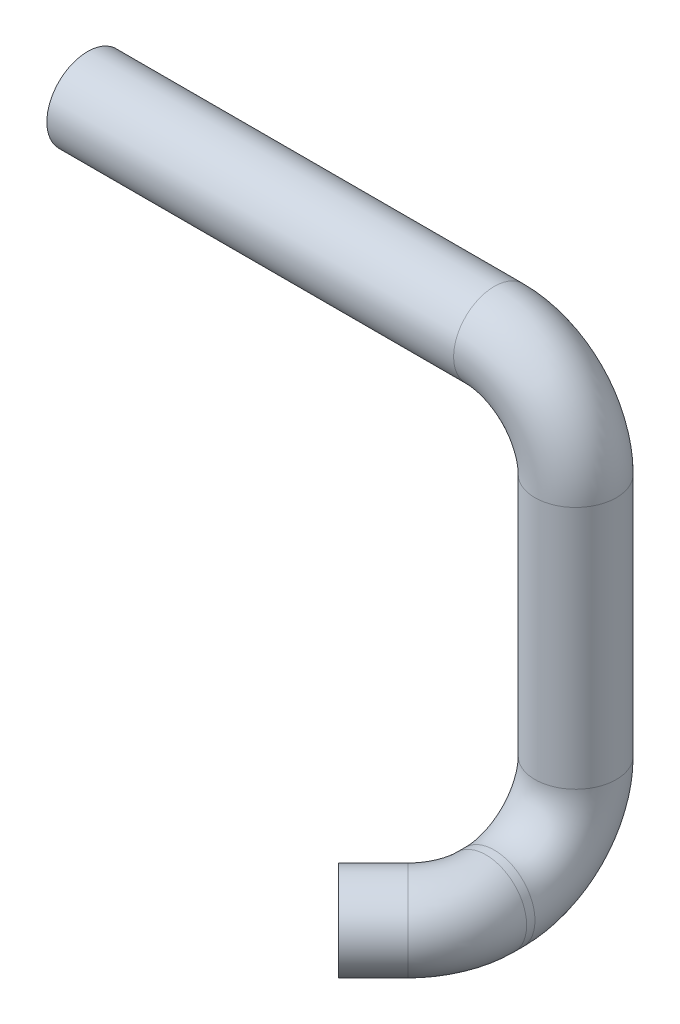
ISO-10303-21;
HEADER;
FILE_DESCRIPTION(('STEP AP214'),'2;1');
FILE_NAME('part.step','',(''),(''),'','','');
FILE_SCHEMA(('AUTOMOTIVE_DESIGN { 1 0 10303 214 1 1 1 1 }'));
ENDSEC;
DATA;
#1=APPLICATION_CONTEXT('core data for automotive mechanical design processes');
#2=APPLICATION_PROTOCOL_DEFINITION('international standard','automotive_design',2000,#1);
#3=PRODUCT_CONTEXT('',#1,'mechanical');
#4=PRODUCT('Part','Part','',(#3));
#5=PRODUCT_RELATED_PRODUCT_CATEGORY('part','',(#4));
#6=PRODUCT_DEFINITION_FORMATION('','',#4);
#7=PRODUCT_DEFINITION_CONTEXT('part definition',#1,'design');
#8=PRODUCT_DEFINITION('design','',#6,#7);
#9=PRODUCT_DEFINITION_SHAPE('','',#8);
#10=(LENGTH_UNIT() NAMED_UNIT(*) SI_UNIT(.MILLI.,.METRE.));
#11=(NAMED_UNIT(*) PLANE_ANGLE_UNIT() SI_UNIT($,.RADIAN.));
#12=(NAMED_UNIT(*) SI_UNIT($,.STERADIAN.) SOLID_ANGLE_UNIT());
#13=UNCERTAINTY_MEASURE_WITH_UNIT(LENGTH_MEASURE(1.E-05),#10,'distance_accuracy_value','');
#14=(GEOMETRIC_REPRESENTATION_CONTEXT(3) GLOBAL_UNCERTAINTY_ASSIGNED_CONTEXT((#13)) GLOBAL_UNIT_ASSIGNED_CONTEXT((#10,
#11,#12)) REPRESENTATION_CONTEXT('',''));
#15=CARTESIAN_POINT('',(0.,0.,0.));
#16=DIRECTION('',(0.,0.,1.));
#17=DIRECTION('',(1.,0.,0.));
#18=AXIS2_PLACEMENT_3D('',#15,#16,#17);
#19=CARTESIAN_POINT('',(36.3145229381132,-31.75,11.3104770618868));
#20=DIRECTION('',(-0.707106781186548,0.,0.707106781186547));
#21=DIRECTION('',(0.707106781186547,0.,0.707106781186548));
#22=AXIS2_PLACEMENT_3D('',#19,#20,#21);
#23=CYLINDRICAL_SURFACE('',#22,3.175);
#24=CARTESIAN_POINT('',(36.3145229381132,-31.75,11.3104770618868));
#25=DIRECTION('',(-0.707106781186548,0.,0.707106781186547));
#26=DIRECTION('',(0.,-1.,0.));
#27=AXIS2_PLACEMENT_3D('',#24,#25,#26);
#28=CIRCLE('',#27,3.175);
#29=CARTESIAN_POINT('',(38.5595869683805,-31.75,13.5555410921541));
#30=VERTEX_POINT('',#29);
#31=EDGE_CURVE('E41',#30,#30,#28,.T.);
#32=ORIENTED_EDGE('',*,*,#31,.T.);
#33=EDGE_LOOP('',(#32));
#34=FACE_BOUND('',#33,.T.);
#35=CARTESIAN_POINT('',(33.6098719394654,-31.75,14.0151280605346));
#36=DIRECTION('',(-0.707106781186548,0.,0.707106781186547));
#37=DIRECTION('',(0.,-1.,0.));
#38=AXIS2_PLACEMENT_3D('',#35,#36,#37);
#39=CIRCLE('',#38,3.175);
#40=CARTESIAN_POINT('',(33.6098719394654,-34.925,14.0151280605346));
#41=VERTEX_POINT('',#40);
#42=EDGE_CURVE('E10',#41,#41,#39,.T.);
#43=ORIENTED_EDGE('',*,*,#42,.F.);
#44=EDGE_LOOP('',(#43));
#45=FACE_BOUND('',#44,.T.);
#46=ADVANCED_FACE('F31',(#34,#45),#23,.T.);
#47=CARTESIAN_POINT('',(36.3145229381132,-31.75,11.3104770618868));
#48=DIRECTION('',(-0.707106781186548,0.,0.707106781186547));
#49=DIRECTION('',(0.707106781186547,0.,0.707106781186548));
#50=AXIS2_PLACEMENT_3D('',#47,#48,#49);
#51=CYLINDRICAL_SURFACE('',#50,2.286);
#52=CARTESIAN_POINT('',(36.3145229381132,-31.75,11.3104770618868));
#53=DIRECTION('',(-0.707106781186548,0.,0.707106781186547));
#54=DIRECTION('',(0.,-1.,0.));
#55=AXIS2_PLACEMENT_3D('',#52,#53,#54);
#56=CIRCLE('',#55,2.286);
#57=CARTESIAN_POINT('',(37.9309690399056,-31.75,12.9269231636792));
#58=VERTEX_POINT('',#57);
#59=EDGE_CURVE('E45',#58,#58,#56,.T.);
#60=ORIENTED_EDGE('',*,*,#59,.F.);
#61=EDGE_LOOP('',(#60));
#62=FACE_BOUND('',#61,.T.);
#63=CARTESIAN_POINT('',(33.6098719394654,-31.75,14.0151280605346));
#64=DIRECTION('',(-0.707106781186548,0.,0.707106781186547));
#65=DIRECTION('',(0.,-1.,0.));
#66=AXIS2_PLACEMENT_3D('',#63,#64,#65);
#67=CIRCLE('',#66,2.286);
#68=CARTESIAN_POINT('',(33.6098719394654,-34.036,14.0151280605346));
#69=VERTEX_POINT('',#68);
#70=EDGE_CURVE('E37',#69,#69,#67,.T.);
#71=ORIENTED_EDGE('',*,*,#70,.T.);
#72=EDGE_LOOP('',(#71));
#73=FACE_BOUND('',#72,.T.);
#74=ADVANCED_FACE('F125',(#62,#73),#51,.F.);
#75=CARTESIAN_POINT('',(32.004,-31.75,6.9999541237736));
#76=DIRECTION('',(0.,-1.,0.));
#77=DIRECTION('',(0.,0.,-1.));
#78=AXIS2_PLACEMENT_3D('',#75,#76,#77);
#79=TOROIDAL_SURFACE('',#78,6.09599999999999,3.175);
#80=CARTESIAN_POINT('',(38.1,-31.75,6.9999541237736));
#81=DIRECTION('',(0.,0.,1.));
#82=DIRECTION('',(0.,-1.,0.));
#83=AXIS2_PLACEMENT_3D('',#80,#81,#82);
#84=CIRCLE('',#83,3.175);
#85=CARTESIAN_POINT('',(41.275,-31.75,6.9999541237736));
#86=VERTEX_POINT('',#85);
#87=EDGE_CURVE('E50',#86,#86,#84,.T.);
#88=CARTESIAN_POINT('',(32.004,-31.75,6.9999541237736));
#89=DIRECTION('',(0.,-1.,0.));
#90=DIRECTION('',(0.,0.,-1.));
#91=AXIS2_PLACEMENT_3D('',#88,#89,#90);
#92=CIRCLE('',#91,9.27099999999999);
#93=EDGE_CURVE('',#86,#30,#92,.T.);
#94=ORIENTED_EDGE('',*,*,#87,.T.);
#95=ORIENTED_EDGE('',*,*,#31,.F.);
#96=ORIENTED_EDGE('',*,*,#93,.T.);
#97=ORIENTED_EDGE('',*,*,#93,.F.);
#98=EDGE_LOOP('',(#94,#96,#95,#97));
#99=FACE_BOUND('',#98,.T.);
#100=ADVANCED_FACE('F121',(#99),#79,.T.);
#101=CARTESIAN_POINT('',(32.004,-31.75,6.9999541237736));
#102=DIRECTION('',(0.,-1.,0.));
#103=DIRECTION('',(0.,0.,-1.));
#104=AXIS2_PLACEMENT_3D('',#101,#102,#103);
#105=TOROIDAL_SURFACE('',#104,6.09599999999999,2.286);
#106=CARTESIAN_POINT('',(38.1,-31.75,6.9999541237736));
#107=DIRECTION('',(0.,0.,1.));
#108=DIRECTION('',(0.,-1.,0.));
#109=AXIS2_PLACEMENT_3D('',#106,#107,#108);
#110=CIRCLE('',#109,2.286);
#111=CARTESIAN_POINT('',(40.386,-31.75,6.9999541237736));
#112=VERTEX_POINT('',#111);
#113=EDGE_CURVE('E53',#112,#112,#110,.T.);
#114=CARTESIAN_POINT('',(32.004,-31.75,6.9999541237736));
#115=DIRECTION('',(0.,-1.,0.));
#116=DIRECTION('',(0.,0.,-1.));
#117=AXIS2_PLACEMENT_3D('',#114,#115,#116);
#118=CIRCLE('',#117,8.38199999999999);
#119=EDGE_CURVE('',#112,#58,#118,.T.);
#120=ORIENTED_EDGE('',*,*,#113,.F.);
#121=ORIENTED_EDGE('',*,*,#59,.T.);
#122=ORIENTED_EDGE('',*,*,#119,.T.);
#123=ORIENTED_EDGE('',*,*,#119,.F.);
#124=EDGE_LOOP('',(#120,#122,#121,#123));
#125=FACE_BOUND('',#124,.T.);
#126=ADVANCED_FACE('F118',(#125),#105,.F.);
#127=CARTESIAN_POINT('',(38.1,-31.75,6.35));
#128=DIRECTION('',(0.,0.,1.));
#129=DIRECTION('',(1.,0.,0.));
#130=AXIS2_PLACEMENT_3D('',#127,#128,#129);
#131=CYLINDRICAL_SURFACE('',#130,3.175);
#132=CARTESIAN_POINT('',(38.1,-31.75,6.35));
#133=DIRECTION('',(0.,0.,1.));
#134=DIRECTION('',(0.,-1.,0.));
#135=AXIS2_PLACEMENT_3D('',#132,#133,#134);
#136=CIRCLE('',#135,3.175);
#137=CARTESIAN_POINT('',(38.1,-34.925,6.35));
#138=VERTEX_POINT('',#137);
#139=EDGE_CURVE('E56',#138,#138,#136,.T.);
#140=ORIENTED_EDGE('',*,*,#139,.T.);
#141=EDGE_LOOP('',(#140));
#142=FACE_BOUND('',#141,.T.);
#143=ORIENTED_EDGE('',*,*,#87,.F.);
#144=EDGE_LOOP('',(#143));
#145=FACE_BOUND('',#144,.T.);
#146=ADVANCED_FACE('F114',(#142,#145),#131,.T.);
#147=CARTESIAN_POINT('',(38.1,-31.75,6.35));
#148=DIRECTION('',(0.,0.,1.));
#149=DIRECTION('',(1.,0.,0.));
#150=AXIS2_PLACEMENT_3D('',#147,#148,#149);
#151=CYLINDRICAL_SURFACE('',#150,2.286);
#152=CARTESIAN_POINT('',(38.1,-31.75,6.35));
#153=DIRECTION('',(0.,0.,1.));
#154=DIRECTION('',(0.,-1.,0.));
#155=AXIS2_PLACEMENT_3D('',#152,#153,#154);
#156=CIRCLE('',#155,2.286);
#157=CARTESIAN_POINT('',(38.1,-34.036,6.35));
#158=VERTEX_POINT('',#157);
#159=EDGE_CURVE('E59',#158,#158,#156,.T.);
#160=ORIENTED_EDGE('',*,*,#159,.F.);
#161=EDGE_LOOP('',(#160));
#162=FACE_BOUND('',#161,.T.);
#163=ORIENTED_EDGE('',*,*,#113,.T.);
#164=EDGE_LOOP('',(#163));
#165=FACE_BOUND('',#164,.T.);
#166=ADVANCED_FACE('F111',(#162,#165),#151,.F.);
#167=CARTESIAN_POINT('',(38.1,-25.4,6.35));
#168=DIRECTION('',(-1.,0.,0.));
#169=DIRECTION('',(0.,0.,1.));
#170=AXIS2_PLACEMENT_3D('',#167,#168,#169);
#171=TOROIDAL_SURFACE('',#170,6.35,3.175);
#172=CARTESIAN_POINT('',(38.1,-25.4,0.));
#173=DIRECTION('',(0.,-1.,0.));
#174=DIRECTION('',(0.,0.,-1.));
#175=AXIS2_PLACEMENT_3D('',#172,#173,#174);
#176=CIRCLE('',#175,3.175);
#177=CARTESIAN_POINT('',(38.1,-25.4,-3.175));
#178=VERTEX_POINT('',#177);
#179=EDGE_CURVE('E62',#178,#178,#176,.T.);
#180=CARTESIAN_POINT('',(38.1,-25.4,6.35));
#181=DIRECTION('',(-1.,0.,0.));
#182=DIRECTION('',(0.,0.,1.));
#183=AXIS2_PLACEMENT_3D('',#180,#181,#182);
#184=CIRCLE('',#183,9.525);
#185=EDGE_CURVE('',#178,#138,#184,.T.);
#186=ORIENTED_EDGE('',*,*,#179,.T.);
#187=ORIENTED_EDGE('',*,*,#139,.F.);
#188=ORIENTED_EDGE('',*,*,#185,.T.);
#189=ORIENTED_EDGE('',*,*,#185,.F.);
#190=EDGE_LOOP('',(#186,#188,#187,#189));
#191=FACE_BOUND('',#190,.T.);
#192=ADVANCED_FACE('F107',(#191),#171,.T.);
#193=CARTESIAN_POINT('',(38.1,-25.4,6.35));
#194=DIRECTION('',(-1.,0.,0.));
#195=DIRECTION('',(0.,0.,1.));
#196=AXIS2_PLACEMENT_3D('',#193,#194,#195);
#197=TOROIDAL_SURFACE('',#196,6.35,2.286);
#198=CARTESIAN_POINT('',(38.1,-25.4,0.));
#199=DIRECTION('',(0.,-1.,0.));
#200=DIRECTION('',(0.,0.,-1.));
#201=AXIS2_PLACEMENT_3D('',#198,#199,#200);
#202=CIRCLE('',#201,2.286);
#203=CARTESIAN_POINT('',(38.1,-25.4,-2.286));
#204=VERTEX_POINT('',#203);
#205=EDGE_CURVE('E65',#204,#204,#202,.T.);
#206=CARTESIAN_POINT('',(38.1,-25.4,6.35));
#207=DIRECTION('',(-1.,0.,0.));
#208=DIRECTION('',(0.,0.,1.));
#209=AXIS2_PLACEMENT_3D('',#206,#207,#208);
#210=CIRCLE('',#209,8.636);
#211=EDGE_CURVE('',#204,#158,#210,.T.);
#212=ORIENTED_EDGE('',*,*,#205,.F.);
#213=ORIENTED_EDGE('',*,*,#159,.T.);
#214=ORIENTED_EDGE('',*,*,#211,.T.);
#215=ORIENTED_EDGE('',*,*,#211,.F.);
#216=EDGE_LOOP('',(#212,#214,#213,#215));
#217=FACE_BOUND('',#216,.T.);
#218=ADVANCED_FACE('F104',(#217),#197,.F.);
#219=CARTESIAN_POINT('',(38.1,-6.35,0.));
#220=DIRECTION('',(0.,-1.,0.));
#221=DIRECTION('',(0.,0.,-1.));
#222=AXIS2_PLACEMENT_3D('',#219,#220,#221);
#223=CYLINDRICAL_SURFACE('',#222,3.175);
#224=CARTESIAN_POINT('',(38.1,-6.35,0.));
#225=DIRECTION('',(0.,-1.,0.));
#226=DIRECTION('',(0.,0.,-1.));
#227=AXIS2_PLACEMENT_3D('',#224,#225,#226);
#228=CIRCLE('',#227,3.175);
#229=CARTESIAN_POINT('',(41.275,-6.35,0.));
#230=VERTEX_POINT('',#229);
#231=EDGE_CURVE('E68',#230,#230,#228,.T.);
#232=ORIENTED_EDGE('',*,*,#231,.T.);
#233=EDGE_LOOP('',(#232));
#234=FACE_BOUND('',#233,.T.);
#235=ORIENTED_EDGE('',*,*,#179,.F.);
#236=EDGE_LOOP('',(#235));
#237=FACE_BOUND('',#236,.T.);
#238=ADVANCED_FACE('F100',(#234,#237),#223,.T.);
#239=CARTESIAN_POINT('',(38.1,-6.35,0.));
#240=DIRECTION('',(0.,-1.,0.));
#241=DIRECTION('',(0.,0.,-1.));
#242=AXIS2_PLACEMENT_3D('',#239,#240,#241);
#243=CYLINDRICAL_SURFACE('',#242,2.286);
#244=CARTESIAN_POINT('',(38.1,-6.35,0.));
#245=DIRECTION('',(0.,-1.,0.));
#246=DIRECTION('',(0.,0.,-1.));
#247=AXIS2_PLACEMENT_3D('',#244,#245,#246);
#248=CIRCLE('',#247,2.286);
#249=CARTESIAN_POINT('',(40.386,-6.35,0.));
#250=VERTEX_POINT('',#249);
#251=EDGE_CURVE('E71',#250,#250,#248,.T.);
#252=ORIENTED_EDGE('',*,*,#251,.F.);
#253=EDGE_LOOP('',(#252));
#254=FACE_BOUND('',#253,.T.);
#255=ORIENTED_EDGE('',*,*,#205,.T.);
#256=EDGE_LOOP('',(#255));
#257=FACE_BOUND('',#256,.T.);
#258=ADVANCED_FACE('F97',(#254,#257),#243,.F.);
#259=CARTESIAN_POINT('',(31.75,-6.35,0.));
#260=DIRECTION('',(0.,0.,-1.));
#261=DIRECTION('',(-1.,0.,0.));
#262=AXIS2_PLACEMENT_3D('',#259,#260,#261);
#263=TOROIDAL_SURFACE('',#262,6.35,3.175);
#264=CARTESIAN_POINT('',(31.75,0.,0.));
#265=DIRECTION('',(1.,0.,0.));
#266=DIRECTION('',(0.,0.,-1.));
#267=AXIS2_PLACEMENT_3D('',#264,#265,#266);
#268=CIRCLE('',#267,3.175);
#269=CARTESIAN_POINT('',(31.75,3.175,0.));
#270=VERTEX_POINT('',#269);
#271=EDGE_CURVE('E74',#270,#270,#268,.T.);
#272=CARTESIAN_POINT('',(31.75,-6.35,0.));
#273=DIRECTION('',(0.,0.,-1.));
#274=DIRECTION('',(-1.,0.,0.));
#275=AXIS2_PLACEMENT_3D('',#272,#273,#274);
#276=CIRCLE('',#275,9.525);
#277=EDGE_CURVE('',#270,#230,#276,.T.);
#278=ORIENTED_EDGE('',*,*,#271,.T.);
#279=ORIENTED_EDGE('',*,*,#231,.F.);
#280=ORIENTED_EDGE('',*,*,#277,.T.);
#281=ORIENTED_EDGE('',*,*,#277,.F.);
#282=EDGE_LOOP('',(#278,#280,#279,#281));
#283=FACE_BOUND('',#282,.T.);
#284=ADVANCED_FACE('F93',(#283),#263,.T.);
#285=CARTESIAN_POINT('',(31.75,-6.35,0.));
#286=DIRECTION('',(0.,0.,-1.));
#287=DIRECTION('',(-1.,0.,0.));
#288=AXIS2_PLACEMENT_3D('',#285,#286,#287);
#289=TOROIDAL_SURFACE('',#288,6.35,2.286);
#290=CARTESIAN_POINT('',(31.75,0.,0.));
#291=DIRECTION('',(1.,0.,0.));
#292=DIRECTION('',(0.,0.,-1.));
#293=AXIS2_PLACEMENT_3D('',#290,#291,#292);
#294=CIRCLE('',#293,2.286);
#295=CARTESIAN_POINT('',(31.75,2.286,0.));
#296=VERTEX_POINT('',#295);
#297=EDGE_CURVE('E78',#296,#296,#294,.T.);
#298=CARTESIAN_POINT('',(31.75,-6.35,0.));
#299=DIRECTION('',(0.,0.,-1.));
#300=DIRECTION('',(-1.,0.,0.));
#301=AXIS2_PLACEMENT_3D('',#298,#299,#300);
#302=CIRCLE('',#301,8.636);
#303=EDGE_CURVE('',#296,#250,#302,.T.);
#304=ORIENTED_EDGE('',*,*,#297,.F.);
#305=ORIENTED_EDGE('',*,*,#251,.T.);
#306=ORIENTED_EDGE('',*,*,#303,.T.);
#307=ORIENTED_EDGE('',*,*,#303,.F.);
#308=EDGE_LOOP('',(#304,#306,#305,#307));
#309=FACE_BOUND('',#308,.T.);
#310=ADVANCED_FACE('F90',(#309),#289,.F.);
#311=CARTESIAN_POINT('',(31.75,0.,0.));
#312=DIRECTION('',(-1.,0.,0.));
#313=DIRECTION('',(0.,0.,1.));
#314=AXIS2_PLACEMENT_3D('',#311,#312,#313);
#315=CYLINDRICAL_SURFACE('',#314,2.286);
#316=ORIENTED_EDGE('',*,*,#297,.T.);
#317=EDGE_LOOP('',(#316));
#318=FACE_BOUND('',#317,.T.);
#319=CARTESIAN_POINT('',(0.,0.,0.));
#320=DIRECTION('',(1.,0.,0.));
#321=DIRECTION('',(0.,0.,-1.));
#322=AXIS2_PLACEMENT_3D('',#319,#320,#321);
#323=CIRCLE('',#322,2.286);
#324=CARTESIAN_POINT('',(0.,0.,-2.286));
#325=VERTEX_POINT('',#324);
#326=EDGE_CURVE('E79',#325,#325,#323,.T.);
#327=ORIENTED_EDGE('',*,*,#326,.F.);
#328=EDGE_LOOP('',(#327));
#329=FACE_BOUND('',#328,.T.);
#330=ADVANCED_FACE('F87',(#318,#329),#315,.F.);
#331=CARTESIAN_POINT('',(31.75,0.,0.));
#332=DIRECTION('',(-1.,0.,0.));
#333=DIRECTION('',(0.,0.,1.));
#334=AXIS2_PLACEMENT_3D('',#331,#332,#333);
#335=CYLINDRICAL_SURFACE('',#334,3.175);
#336=ORIENTED_EDGE('',*,*,#271,.F.);
#337=EDGE_LOOP('',(#336));
#338=FACE_BOUND('',#337,.T.);
#339=CARTESIAN_POINT('',(0.,0.,0.));
#340=DIRECTION('',(1.,0.,0.));
#341=DIRECTION('',(0.,0.,-1.));
#342=AXIS2_PLACEMENT_3D('',#339,#340,#341);
#343=CIRCLE('',#342,3.175);
#344=CARTESIAN_POINT('',(0.,0.,-3.175));
#345=VERTEX_POINT('',#344);
#346=EDGE_CURVE('E75',#345,#345,#343,.T.);
#347=ORIENTED_EDGE('',*,*,#346,.T.);
#348=EDGE_LOOP('',(#347));
#349=FACE_BOUND('',#348,.T.);
#350=ADVANCED_FACE('F149',(#338,#349),#335,.T.);
#351=CARTESIAN_POINT('',(33.6098719394654,-31.75,14.0151280605346));
#352=DIRECTION('',(-0.707106781186548,0.,0.707106781186547));
#353=DIRECTION('',(0.,-1.,0.));
#354=AXIS2_PLACEMENT_3D('',#351,#352,#353);
#355=PLANE('',#354);
#356=ORIENTED_EDGE('',*,*,#70,.F.);
#357=EDGE_LOOP('',(#356));
#358=FACE_BOUND('',#357,.T.);
#359=ORIENTED_EDGE('',*,*,#42,.T.);
#360=EDGE_LOOP('',(#359));
#361=FACE_BOUND('',#360,.T.);
#362=ADVANCED_FACE('F152',(#358,#361),#355,.T.);
#363=CARTESIAN_POINT('',(0.,0.,0.));
#364=DIRECTION('',(1.,0.,0.));
#365=DIRECTION('',(0.,0.,-1.));
#366=AXIS2_PLACEMENT_3D('',#363,#364,#365);
#367=PLANE('',#366);
#368=ORIENTED_EDGE('',*,*,#326,.T.);
#369=EDGE_LOOP('',(#368));
#370=FACE_BOUND('',#369,.T.);
#371=ORIENTED_EDGE('',*,*,#346,.F.);
#372=EDGE_LOOP('',(#371));
#373=FACE_BOUND('',#372,.T.);
#374=ADVANCED_FACE('F154',(#370,#373),#367,.F.);
#375=CLOSED_SHELL('',(#46,#74,#100,#126,#146,#166,#192,#218,#238,#258,#284,#310,#330,#350,#362,#374));
#376=MANIFOLD_SOLID_BREP('B2',#375);
#377=ADVANCED_BREP_SHAPE_REPRESENTATION('',(#18,#376),#14);
#378=SHAPE_DEFINITION_REPRESENTATION(#9,#377);
ENDSEC;
END-ISO-10303-21;
